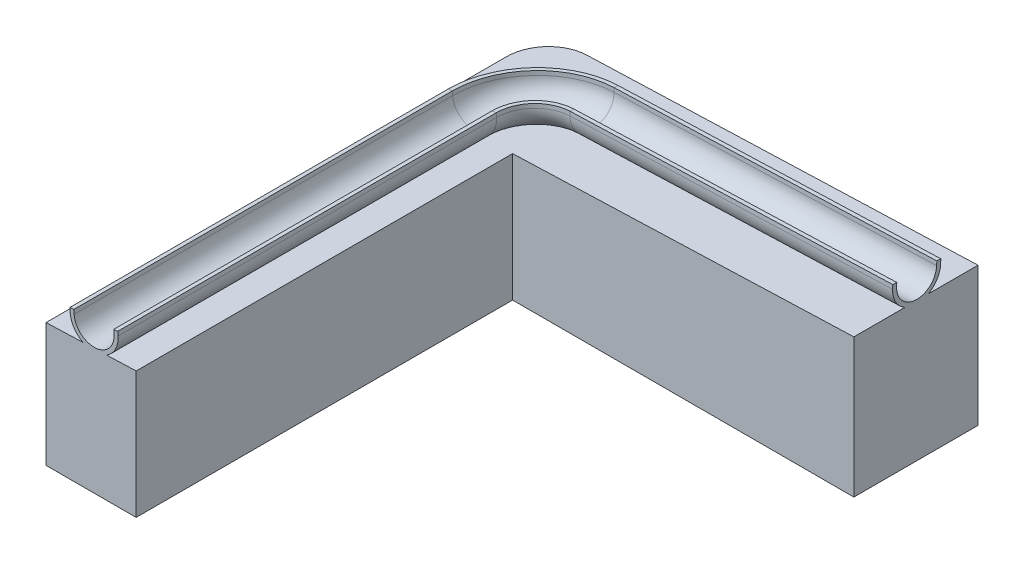
ISO-10303-21;
HEADER;
FILE_DESCRIPTION(('STEP AP214'),'2;1');
FILE_NAME('part.step','',(''),(''),'','','');
FILE_SCHEMA(('AUTOMOTIVE_DESIGN { 1 0 10303 214 1 1 1 1 }'));
ENDSEC;
DATA;
#1=APPLICATION_CONTEXT('core data for automotive mechanical design processes');
#2=APPLICATION_PROTOCOL_DEFINITION('international standard','automotive_design',2000,#1);
#3=PRODUCT_CONTEXT('',#1,'mechanical');
#4=PRODUCT('Part','Part','',(#3));
#5=PRODUCT_RELATED_PRODUCT_CATEGORY('part','',(#4));
#6=PRODUCT_DEFINITION_FORMATION('','',#4);
#7=PRODUCT_DEFINITION_CONTEXT('part definition',#1,'design');
#8=PRODUCT_DEFINITION('design','',#6,#7);
#9=PRODUCT_DEFINITION_SHAPE('','',#8);
#10=(LENGTH_UNIT() NAMED_UNIT(*) SI_UNIT(.MILLI.,.METRE.));
#11=(NAMED_UNIT(*) PLANE_ANGLE_UNIT() SI_UNIT($,.RADIAN.));
#12=(NAMED_UNIT(*) SI_UNIT($,.STERADIAN.) SOLID_ANGLE_UNIT());
#13=UNCERTAINTY_MEASURE_WITH_UNIT(LENGTH_MEASURE(1.E-05),#10,'distance_accuracy_value','');
#14=(GEOMETRIC_REPRESENTATION_CONTEXT(3) GLOBAL_UNCERTAINTY_ASSIGNED_CONTEXT((#13)) GLOBAL_UNIT_ASSIGNED_CONTEXT((#10,
#11,#12)) REPRESENTATION_CONTEXT('',''));
#15=CARTESIAN_POINT('',(0.,0.,0.));
#16=DIRECTION('',(0.,0.,1.));
#17=DIRECTION('',(1.,0.,0.));
#18=AXIS2_PLACEMENT_3D('',#15,#16,#17);
#19=CARTESIAN_POINT('',(0.,-52.6973639920468,0.));
#20=DIRECTION('',(0.,-1.,0.));
#21=DIRECTION('',(0.,0.,-1.));
#22=AXIS2_PLACEMENT_3D('',#19,#20,#21);
#23=PLANE('',#22);
#24=DIRECTION('',(0.,0.,-1.));
#25=VECTOR('',#24,1.);
#26=CARTESIAN_POINT('',(-80.,-52.6973639920468,0.));
#27=LINE('',#26,#25);
#28=CARTESIAN_POINT('',(-80.,-52.6973639920468,33.9999999999974));
#29=VERTEX_POINT('',#28);
#30=CARTESIAN_POINT('',(-80.,-52.6973639920469,-60.));
#31=VERTEX_POINT('',#30);
#32=EDGE_CURVE('E214',#29,#31,#27,.T.);
#33=ORIENTED_EDGE('',*,*,#32,.F.);
#34=DIRECTION('',(1.,0.,0.));
#35=VECTOR('',#34,1.);
#36=CARTESIAN_POINT('',(0.,-52.6973639920468,33.9999999999975));
#37=LINE('',#36,#35);
#38=CARTESIAN_POINT('',(-102.508702833862,-52.6973639920468,33.9999999999975));
#39=VERTEX_POINT('',#38);
#40=EDGE_CURVE('E268',#39,#29,#37,.T.);
#41=ORIENTED_EDGE('',*,*,#40,.F.);
#42=DIRECTION('',(0.,0.,1.));
#43=VECTOR('',#42,1.);
#44=CARTESIAN_POINT('',(-102.508702833862,-52.6973639920468,78.5000726509589));
#45=LINE('',#44,#43);
#46=CARTESIAN_POINT('',(-102.508702833862,-52.6973639920468,-81.));
#47=VERTEX_POINT('',#46);
#48=EDGE_CURVE('E270',#47,#39,#45,.T.);
#49=ORIENTED_EDGE('',*,*,#48,.F.);
#50=CARTESIAN_POINT('',(-92.5087028338616,-52.6973639920468,-81.));
#51=DIRECTION('',(0.,-1.,0.));
#52=DIRECTION('',(0.,0.,-1.));
#53=AXIS2_PLACEMENT_3D('',#50,#51,#52);
#54=CIRCLE('',#53,10.);
#55=CARTESIAN_POINT('',(-92.5087028338616,-52.6973639920468,-91.));
#56=VERTEX_POINT('',#55);
#57=EDGE_CURVE('E11',#47,#56,#54,.T.);
#58=ORIENTED_EDGE('',*,*,#57,.T.);
#59=DIRECTION('',(-1.,0.,0.));
#60=VECTOR('',#59,1.);
#61=CARTESIAN_POINT('',(5.20948620237505,-52.6973639920468,-91.));
#62=LINE('',#61,#60);
#63=CARTESIAN_POINT('',(5.20948620237505,-52.6973639920468,-91.));
#64=VERTEX_POINT('',#63);
#65=EDGE_CURVE('E222',#64,#56,#62,.T.);
#66=ORIENTED_EDGE('',*,*,#65,.F.);
#67=DIRECTION('',(0.,0.,-1.));
#68=VECTOR('',#67,1.);
#69=CARTESIAN_POINT('',(5.20948620237505,-52.6973639920468,148.114783010654));
#70=LINE('',#69,#68);
#71=CARTESIAN_POINT('',(5.20948620237505,-52.6973639920468,-60.));
#72=VERTEX_POINT('',#71);
#73=EDGE_CURVE('E218',#72,#64,#70,.T.);
#74=ORIENTED_EDGE('',*,*,#73,.F.);
#75=DIRECTION('',(-1.,0.,0.));
#76=VECTOR('',#75,1.);
#77=CARTESIAN_POINT('',(5.20948620237505,-52.6973639920468,-60.));
#78=LINE('',#77,#76);
#79=EDGE_CURVE('E211',#72,#31,#78,.T.);
#80=ORIENTED_EDGE('',*,*,#79,.T.);
#81=EDGE_LOOP('',(#33,#41,#49,#58,#66,#74,#80));
#82=FACE_BOUND('',#81,.T.);
#83=ADVANCED_FACE('F33',(#82),#23,.T.);
#84=CARTESIAN_POINT('',(-84.5201097219953,-15.7296405085045,-60.5000000000001));
#85=DIRECTION('',(0.997564050259842,0.0697564737438712,0.));
#86=DIRECTION('',(-0.0697564737438712,0.997564050259842,0.));
#87=AXIS2_PLACEMENT_3D('',#84,#85,#86);
#88=PLANE('',#87);
#89=DIRECTION('',(-0.0697564737438712,0.997564050259842,0.));
#90=VECTOR('',#89,1.);
#91=CARTESIAN_POINT('',(-84.5201097219953,-15.7296405085045,-60.5000000000001));
#92=LINE('',#91,#90);
#93=CARTESIAN_POINT('',(-84.5201097219953,-15.7296405085045,-60.5000000000001));
#94=VERTEX_POINT('',#93);
#95=CARTESIAN_POINT('',(-84.5898661957392,-14.7320764582446,-60.5000000000001));
#96=VERTEX_POINT('',#95);
#97=EDGE_CURVE('E326',#94,#96,#92,.T.);
#98=ORIENTED_EDGE('',*,*,#97,.T.);
#99=DIRECTION('',(0.,0.,1.));
#100=VECTOR('',#99,1.);
#101=CARTESIAN_POINT('',(-84.5898661957392,-14.7320764582446,-60.5000000000001));
#102=LINE('',#101,#100);
#103=CARTESIAN_POINT('',(-84.5898661957392,-14.7320764582446,33.9999999999974));
#104=VERTEX_POINT('',#103);
#105=EDGE_CURVE('E407',#96,#104,#102,.T.);
#106=ORIENTED_EDGE('',*,*,#105,.T.);
#107=DIRECTION('',(-0.0697564737438712,0.997564050259842,0.));
#108=VECTOR('',#107,1.);
#109=CARTESIAN_POINT('',(-84.5201097219953,-15.7296405085045,33.9999999999974));
#110=LINE('',#109,#108);
#111=CARTESIAN_POINT('',(-84.5201097219953,-15.7296405085045,33.9999999999974));
#112=VERTEX_POINT('',#111);
#113=EDGE_CURVE('E383',#112,#104,#110,.T.);
#114=ORIENTED_EDGE('',*,*,#113,.F.);
#115=DIRECTION('',(0.,0.,1.));
#116=VECTOR('',#115,1.);
#117=CARTESIAN_POINT('',(-84.5201097219953,-15.7296405085045,-60.5000000000001));
#118=LINE('',#117,#116);
#119=EDGE_CURVE('E410',#94,#112,#118,.T.);
#120=ORIENTED_EDGE('',*,*,#119,.F.);
#121=EDGE_LOOP('',(#98,#106,#114,#120));
#122=FACE_BOUND('',#121,.T.);
#123=ADVANCED_FACE('F474',(#122),#88,.T.);
#124=CARTESIAN_POINT('',(-84.5898661957392,-14.7320764582446,-60.5000000000001));
#125=DIRECTION('',(-0.0697564737441103,0.997564050259825,0.));
#126=DIRECTION('',(-0.997564050259825,-0.0697564737441103,0.));
#127=AXIS2_PLACEMENT_3D('',#124,#125,#126);
#128=PLANE('',#127);
#129=DIRECTION('',(-0.997564050259825,-0.0697564737441103,0.));
#130=VECTOR('',#129,1.);
#131=CARTESIAN_POINT('',(-84.5898661957392,-14.7320764582446,-60.5000000000001));
#132=LINE('',#131,#130);
#133=CARTESIAN_POINT('',(-85.5874302459995,-14.8018329319888,-60.5000000000001));
#134=VERTEX_POINT('',#133);
#135=EDGE_CURVE('E323',#96,#134,#132,.T.);
#136=ORIENTED_EDGE('',*,*,#135,.T.);
#137=DIRECTION('',(0.,0.,1.));
#138=VECTOR('',#137,1.);
#139=CARTESIAN_POINT('',(-85.5874302459995,-14.8018329319888,-60.5000000000001));
#140=LINE('',#139,#138);
#141=CARTESIAN_POINT('',(-85.5874302459995,-14.8018329319888,33.9999999999974));
#142=VERTEX_POINT('',#141);
#143=EDGE_CURVE('E404',#134,#142,#140,.T.);
#144=ORIENTED_EDGE('',*,*,#143,.T.);
#145=DIRECTION('',(-0.997564050259825,-0.0697564737441103,0.));
#146=VECTOR('',#145,1.);
#147=CARTESIAN_POINT('',(-84.5898661957392,-14.7320764582446,33.9999999999974));
#148=LINE('',#147,#146);
#149=EDGE_CURVE('E380',#104,#142,#148,.T.);
#150=ORIENTED_EDGE('',*,*,#149,.F.);
#151=ORIENTED_EDGE('',*,*,#105,.F.);
#152=EDGE_LOOP('',(#136,#144,#150,#151));
#153=FACE_BOUND('',#152,.T.);
#154=ADVANCED_FACE('F480',(#153),#128,.T.);
#155=CARTESIAN_POINT('',(-85.5874302459995,-14.8018329319888,-60.5000000000001));
#156=DIRECTION('',(-0.997564050259814,-0.069756473744273,0.));
#157=DIRECTION('',(0.069756473744273,-0.997564050259814,0.));
#158=AXIS2_PLACEMENT_3D('',#155,#156,#157);
#159=PLANE('',#158);
#160=DIRECTION('',(0.069756473744273,-0.997564050259814,0.));
#161=VECTOR('',#160,1.);
#162=CARTESIAN_POINT('',(-85.5874302459995,-14.8018329319888,-60.5000000000001));
#163=LINE('',#162,#161);
#164=CARTESIAN_POINT('',(-85.5176737722553,-15.7993969822486,-60.5000000000001));
#165=VERTEX_POINT('',#164);
#166=EDGE_CURVE('E320',#134,#165,#163,.T.);
#167=ORIENTED_EDGE('',*,*,#166,.T.);
#168=DIRECTION('',(0.,0.,1.));
#169=VECTOR('',#168,1.);
#170=CARTESIAN_POINT('',(-85.5176737722553,-15.7993969822486,-60.5000000000001));
#171=LINE('',#170,#169);
#172=CARTESIAN_POINT('',(-85.5176737722552,-15.7993969822486,33.9999999999974));
#173=VERTEX_POINT('',#172);
#174=EDGE_CURVE('E401',#165,#173,#171,.T.);
#175=ORIENTED_EDGE('',*,*,#174,.T.);
#176=DIRECTION('',(0.069756473744273,-0.997564050259814,0.));
#177=VECTOR('',#176,1.);
#178=CARTESIAN_POINT('',(-85.5874302459995,-14.8018329319888,33.9999999999974));
#179=LINE('',#178,#177);
#180=EDGE_CURVE('E377',#142,#173,#179,.T.);
#181=ORIENTED_EDGE('',*,*,#180,.F.);
#182=ORIENTED_EDGE('',*,*,#143,.F.);
#183=EDGE_LOOP('',(#167,#175,#181,#182));
#184=FACE_BOUND('',#183,.T.);
#185=ADVANCED_FACE('F486',(#184),#159,.T.);
#186=CARTESIAN_POINT('',(-90.5054940235545,-16.1481793509691,-60.5));
#187=DIRECTION('',(0.,0.,1.));
#188=DIRECTION('',(1.,0.,0.));
#189=AXIS2_PLACEMENT_3D('',#186,#187,#188);
#190=CYLINDRICAL_SURFACE('',#189,5.00000000000016);
#191=CARTESIAN_POINT('',(-90.5054940235545,-16.1481793509691,-60.5));
#192=DIRECTION('',(0.,0.,-1.));
#193=DIRECTION('',(0.0348994967024938,-0.999390827019096,0.));
#194=AXIS2_PLACEMENT_3D('',#191,#192,#193);
#195=CIRCLE('',#194,5.00000000000016);
#196=CARTESIAN_POINT('',(-95.4933142748538,-16.4969617196897,-60.4999999999999));
#197=VERTEX_POINT('',#196);
#198=EDGE_CURVE('E317',#165,#197,#195,.T.);
#199=ORIENTED_EDGE('',*,*,#198,.T.);
#200=DIRECTION('',(0.,0.,1.));
#201=VECTOR('',#200,1.);
#202=CARTESIAN_POINT('',(-95.4933142748538,-16.4969617196897,-60.4999999999999));
#203=LINE('',#202,#201);
#204=CARTESIAN_POINT('',(-95.4933142748538,-16.4969617196897,33.9999999999975));
#205=VERTEX_POINT('',#204);
#206=EDGE_CURVE('E398',#197,#205,#203,.T.);
#207=ORIENTED_EDGE('',*,*,#206,.T.);
#208=CARTESIAN_POINT('',(-90.5054940235545,-16.1481793509691,33.9999999999975));
#209=DIRECTION('',(0.,0.,-1.));
#210=DIRECTION('',(0.0348994967024938,-0.999390827019096,0.));
#211=AXIS2_PLACEMENT_3D('',#208,#209,#210);
#212=CIRCLE('',#211,5.00000000000016);
#213=EDGE_CURVE('E374',#173,#205,#212,.T.);
#214=ORIENTED_EDGE('',*,*,#213,.F.);
#215=ORIENTED_EDGE('',*,*,#174,.F.);
#216=EDGE_LOOP('',(#199,#207,#214,#215));
#217=FACE_BOUND('',#216,.T.);
#218=ADVANCED_FACE('F492',(#217),#190,.F.);
#219=CARTESIAN_POINT('',(-95.4933142748538,-16.4969617196897,-60.4999999999999));
#220=DIRECTION('',(0.997564050259834,0.069756473743982,0.));
#221=DIRECTION('',(-0.069756473743982,0.997564050259834,0.));
#222=AXIS2_PLACEMENT_3D('',#219,#220,#221);
#223=PLANE('',#222);
#224=DIRECTION('',(-0.069756473743982,0.997564050259834,0.));
#225=VECTOR('',#224,1.);
#226=CARTESIAN_POINT('',(-95.4933142748538,-16.4969617196897,-60.4999999999999));
#227=LINE('',#226,#225);
#228=CARTESIAN_POINT('',(-95.5630707485978,-15.4993976694299,-60.4999999999999));
#229=VERTEX_POINT('',#228);
#230=EDGE_CURVE('E314',#197,#229,#227,.T.);
#231=ORIENTED_EDGE('',*,*,#230,.T.);
#232=DIRECTION('',(0.,0.,1.));
#233=VECTOR('',#232,1.);
#234=CARTESIAN_POINT('',(-95.5630707485978,-15.4993976694299,-60.4999999999999));
#235=LINE('',#234,#233);
#236=CARTESIAN_POINT('',(-95.5630707485978,-15.4993976694299,33.9999999999976));
#237=VERTEX_POINT('',#236);
#238=EDGE_CURVE('E395',#229,#237,#235,.T.);
#239=ORIENTED_EDGE('',*,*,#238,.T.);
#240=DIRECTION('',(-0.069756473743982,0.997564050259834,0.));
#241=VECTOR('',#240,1.);
#242=CARTESIAN_POINT('',(-95.4933142748538,-16.4969617196897,33.9999999999976));
#243=LINE('',#242,#241);
#244=EDGE_CURVE('E371',#205,#237,#243,.T.);
#245=ORIENTED_EDGE('',*,*,#244,.F.);
#246=ORIENTED_EDGE('',*,*,#206,.F.);
#247=EDGE_LOOP('',(#231,#239,#245,#246));
#248=FACE_BOUND('',#247,.T.);
#249=ADVANCED_FACE('F498',(#248),#223,.T.);
#250=CARTESIAN_POINT('',(-95.5630707485978,-15.4993976694299,-60.4999999999999));
#251=DIRECTION('',(-0.0697564737441116,0.997564050259825,0.));
#252=DIRECTION('',(-0.997564050259825,-0.0697564737441116,0.));
#253=AXIS2_PLACEMENT_3D('',#250,#251,#252);
#254=PLANE('',#253);
#255=DIRECTION('',(-0.997564050259825,-0.0697564737441116,0.));
#256=VECTOR('',#255,1.);
#257=CARTESIAN_POINT('',(-95.5630707485978,-15.4993976694299,-60.4999999999999));
#258=LINE('',#257,#256);
#259=CARTESIAN_POINT('',(-96.5606347988576,-15.569154143174,-60.4999999999999));
#260=VERTEX_POINT('',#259);
#261=EDGE_CURVE('E311',#229,#260,#258,.T.);
#262=ORIENTED_EDGE('',*,*,#261,.T.);
#263=DIRECTION('',(0.,0.,1.));
#264=VECTOR('',#263,1.);
#265=CARTESIAN_POINT('',(-96.5606347988576,-15.569154143174,-60.4999999999999));
#266=LINE('',#265,#264);
#267=CARTESIAN_POINT('',(-96.5606347988576,-15.569154143174,33.9999999999976));
#268=VERTEX_POINT('',#267);
#269=EDGE_CURVE('E392',#260,#268,#266,.T.);
#270=ORIENTED_EDGE('',*,*,#269,.T.);
#271=DIRECTION('',(-0.997564050259825,-0.0697564737441116,0.));
#272=VECTOR('',#271,1.);
#273=CARTESIAN_POINT('',(-95.5630707485978,-15.4993976694299,33.9999999999976));
#274=LINE('',#273,#272);
#275=EDGE_CURVE('E368',#237,#268,#274,.T.);
#276=ORIENTED_EDGE('',*,*,#275,.F.);
#277=ORIENTED_EDGE('',*,*,#238,.F.);
#278=EDGE_LOOP('',(#262,#270,#276,#277));
#279=FACE_BOUND('',#278,.T.);
#280=ADVANCED_FACE('F504',(#279),#254,.T.);
#281=CARTESIAN_POINT('',(-96.5606347988576,-15.569154143174,-60.4999999999999));
#282=DIRECTION('',(-0.997564050259822,-0.0697564737441621,0.));
#283=DIRECTION('',(0.0697564737441621,-0.997564050259822,0.));
#284=AXIS2_PLACEMENT_3D('',#281,#282,#283);
#285=PLANE('',#284);
#286=DIRECTION('',(0.0697564737441621,-0.997564050259822,0.));
#287=VECTOR('',#286,1.);
#288=CARTESIAN_POINT('',(-96.5606347988576,-15.569154143174,-60.4999999999999));
#289=LINE('',#288,#287);
#290=CARTESIAN_POINT('',(-96.4908783251135,-16.5667181934338,-60.4999999999999));
#291=VERTEX_POINT('',#290);
#292=EDGE_CURVE('E308',#260,#291,#289,.T.);
#293=ORIENTED_EDGE('',*,*,#292,.T.);
#294=DIRECTION('',(0.,0.,1.));
#295=VECTOR('',#294,1.);
#296=CARTESIAN_POINT('',(-96.4908783251135,-16.5667181934338,-60.4999999999999));
#297=LINE('',#296,#295);
#298=CARTESIAN_POINT('',(-96.4908783251135,-16.5667181934338,33.9999999999976));
#299=VERTEX_POINT('',#298);
#300=EDGE_CURVE('E389',#291,#299,#297,.T.);
#301=ORIENTED_EDGE('',*,*,#300,.T.);
#302=DIRECTION('',(0.0697564737441621,-0.997564050259822,0.));
#303=VECTOR('',#302,1.);
#304=CARTESIAN_POINT('',(-96.5606347988576,-15.569154143174,33.9999999999976));
#305=LINE('',#304,#303);
#306=EDGE_CURVE('E365',#268,#299,#305,.T.);
#307=ORIENTED_EDGE('',*,*,#306,.F.);
#308=ORIENTED_EDGE('',*,*,#269,.F.);
#309=EDGE_LOOP('',(#293,#301,#307,#308));
#310=FACE_BOUND('',#309,.T.);
#311=ADVANCED_FACE('F510',(#310),#285,.T.);
#312=CARTESIAN_POINT('',(-90.5054940235545,-16.1481793509691,-60.5));
#313=DIRECTION('',(0.,0.,1.));
#314=DIRECTION('',(1.,0.,0.));
#315=AXIS2_PLACEMENT_3D('',#312,#313,#314);
#316=CYLINDRICAL_SURFACE('',#315,6.00000000000004);
#317=CARTESIAN_POINT('',(-90.5054940235545,-16.1481793509691,-60.5));
#318=DIRECTION('',(0.,0.,1.));
#319=DIRECTION('',(0.0348994967024938,-0.999390827019096,0.));
#320=AXIS2_PLACEMENT_3D('',#317,#318,#319);
#321=CIRCLE('',#320,6.00000000000004);
#322=CARTESIAN_POINT('',(-93.2518846926383,-21.4827213456272,-60.4999999999999));
#323=VERTEX_POINT('',#322);
#324=EDGE_CURVE('E305',#291,#323,#321,.T.);
#325=ORIENTED_EDGE('',*,*,#324,.T.);
#326=DIRECTION('',(0.,0.,1.));
#327=VECTOR('',#326,1.);
#328=CARTESIAN_POINT('',(-93.2518846925721,-21.4827213456613,-60.5));
#329=LINE('',#328,#327);
#330=CARTESIAN_POINT('',(-93.2518846926359,-21.4827213456272,33.9999999999975));
#331=VERTEX_POINT('',#330);
#332=EDGE_CURVE('E450',#323,#331,#329,.T.);
#333=ORIENTED_EDGE('',*,*,#332,.T.);
#334=CARTESIAN_POINT('',(-90.5054940235545,-16.1481793509691,33.9999999999975));
#335=DIRECTION('',(0.,0.,1.));
#336=DIRECTION('',(0.0348994967024938,-0.999390827019096,0.));
#337=AXIS2_PLACEMENT_3D('',#334,#335,#336);
#338=CIRCLE('',#337,6.00000000000004);
#339=EDGE_CURVE('E362',#299,#331,#338,.T.);
#340=ORIENTED_EDGE('',*,*,#339,.F.);
#341=ORIENTED_EDGE('',*,*,#300,.F.);
#342=EDGE_LOOP('',(#325,#333,#340,#341));
#343=FACE_BOUND('',#342,.T.);
#344=ADVANCED_FACE('F515',(#343),#316,.T.);
#345=CARTESIAN_POINT('',(-90.5054940235545,-16.1481793509691,33.9999999999975));
#346=DIRECTION('',(0.,0.,1.));
#347=DIRECTION('',(0.0348994967024938,-0.999390827019096,0.));
#348=AXIS2_PLACEMENT_3D('',#345,#346,#347);
#349=PLANE('',#348);
#350=DIRECTION('',(0.,-1.,0.));
#351=VECTOR('',#350,1.);
#352=CARTESIAN_POINT('',(-80.,-16.1481793509691,33.9999999999973));
#353=LINE('',#352,#351);
#354=CARTESIAN_POINT('',(-80.,-21.0199553349446,33.9999999999975));
#355=VERTEX_POINT('',#354);
#356=EDGE_CURVE('E230',#355,#29,#353,.T.);
#357=ORIENTED_EDGE('',*,*,#356,.F.);
#358=DIRECTION('',(-0.999390827019096,-0.0348994967024937,0.));
#359=VECTOR('',#358,1.);
#360=CARTESIAN_POINT('',(-107.193456897799,-21.9695717749562,33.9999999999975));
#361=LINE('',#360,#359);
#362=CARTESIAN_POINT('',(-87.3936745855202,-21.2781481408425,33.9999999999974));
#363=VERTEX_POINT('',#362);
#364=EDGE_CURVE('E263',#355,#363,#361,.T.);
#365=ORIENTED_EDGE('',*,*,#364,.T.);
#366=CARTESIAN_POINT('',(-90.5054940235545,-16.1481793509691,33.9999999999975));
#367=DIRECTION('',(0.,0.,1.));
#368=DIRECTION('',(0.0348994967024938,-0.999390827019096,0.));
#369=AXIS2_PLACEMENT_3D('',#366,#367,#368);
#370=CIRCLE('',#369,6.00000000000026);
#371=EDGE_CURVE('E386',#363,#112,#370,.T.);
#372=ORIENTED_EDGE('',*,*,#371,.T.);
#373=ORIENTED_EDGE('',*,*,#113,.T.);
#374=ORIENTED_EDGE('',*,*,#149,.T.);
#375=ORIENTED_EDGE('',*,*,#180,.T.);
#376=ORIENTED_EDGE('',*,*,#213,.T.);
#377=ORIENTED_EDGE('',*,*,#244,.T.);
#378=ORIENTED_EDGE('',*,*,#275,.T.);
#379=ORIENTED_EDGE('',*,*,#306,.T.);
#380=ORIENTED_EDGE('',*,*,#339,.T.);
#381=CARTESIAN_POINT('',(-102.508702833862,-21.8059765581639,33.9999999999975));
#382=VERTEX_POINT('',#381);
#383=EDGE_CURVE('E262',#331,#382,#361,.T.);
#384=ORIENTED_EDGE('',*,*,#383,.T.);
#385=DIRECTION('',(0.,1.,0.));
#386=VECTOR('',#385,1.);
#387=CARTESIAN_POINT('',(-102.508702833862,100.717003128766,33.9999999999975));
#388=LINE('',#387,#386);
#389=EDGE_CURVE('E265',#39,#382,#388,.T.);
#390=ORIENTED_EDGE('',*,*,#389,.F.);
#391=ORIENTED_EDGE('',*,*,#40,.T.);
#392=EDGE_LOOP('',(#357,#365,#372,#373,#374,#375,#376,#377,#378,#379,#380,#384,#390,#391));
#393=FACE_BOUND('',#392,.T.);
#394=ADVANCED_FACE('F518',(#393),#349,.T.);
#395=CARTESIAN_POINT('',(-90.5054940235545,-16.1481793509691,-60.5));
#396=DIRECTION('',(0.,0.,1.));
#397=DIRECTION('',(1.,0.,0.));
#398=AXIS2_PLACEMENT_3D('',#395,#396,#397);
#399=CYLINDRICAL_SURFACE('',#398,6.00000000000026);
#400=CARTESIAN_POINT('',(-90.5054940235545,-16.1481793509691,-60.5));
#401=DIRECTION('',(0.,0.,1.));
#402=DIRECTION('',(0.0348994967024938,-0.999390827019096,0.));
#403=AXIS2_PLACEMENT_3D('',#400,#401,#402);
#404=CIRCLE('',#403,6.00000000000026);
#405=CARTESIAN_POINT('',(-87.3936745855748,-21.2781481408785,-60.5));
#406=VERTEX_POINT('',#405);
#407=EDGE_CURVE('E329',#406,#94,#404,.T.);
#408=ORIENTED_EDGE('',*,*,#407,.T.);
#409=ORIENTED_EDGE('',*,*,#119,.T.);
#410=ORIENTED_EDGE('',*,*,#371,.F.);
#411=DIRECTION('',(0.,0.,1.));
#412=VECTOR('',#411,1.);
#413=CARTESIAN_POINT('',(-87.3936745855798,-21.2781481408787,-60.5));
#414=LINE('',#413,#412);
#415=EDGE_CURVE('E428',#363,#406,#414,.F.);
#416=ORIENTED_EDGE('',*,*,#415,.T.);
#417=EDGE_LOOP('',(#408,#409,#410,#416));
#418=FACE_BOUND('',#417,.T.);
#419=ADVANCED_FACE('F455',(#418),#399,.T.);
#420=CARTESIAN_POINT('',(-102.508702833862,100.717003128766,-60.));
#421=DIRECTION('',(1.,0.,0.));
#422=DIRECTION('',(0.,1.,0.));
#423=AXIS2_PLACEMENT_3D('',#420,#421,#422);
#424=PLANE('',#423);
#425=DIRECTION('',(0.,0.,1.));
#426=VECTOR('',#425,1.);
#427=CARTESIAN_POINT('',(-102.508702833862,-21.8059765582036,-60.));
#428=LINE('',#427,#426);
#429=CARTESIAN_POINT('',(-102.508702833862,-21.8059765582036,-81.));
#430=VERTEX_POINT('',#429);
#431=EDGE_CURVE('E414',#430,#382,#428,.T.);
#432=ORIENTED_EDGE('',*,*,#431,.F.);
#433=DIRECTION('',(0.,1.,0.));
#434=VECTOR('',#433,1.);
#435=CARTESIAN_POINT('',(-102.508702833862,-52.6973639920468,-81.));
#436=LINE('',#435,#434);
#437=EDGE_CURVE('E41',#430,#47,#436,.F.);
#438=ORIENTED_EDGE('',*,*,#437,.T.);
#439=ORIENTED_EDGE('',*,*,#48,.T.);
#440=ORIENTED_EDGE('',*,*,#389,.T.);
#441=EDGE_LOOP('',(#432,#438,#439,#440));
#442=FACE_BOUND('',#441,.T.);
#443=ADVANCED_FACE('F552',(#442),#424,.F.);
#444=CARTESIAN_POINT('',(-75.3319172337929,-15.6183063735287,-60.5));
#445=DIRECTION('',(-0.0348994967024938,0.999390827019096,0.));
#446=DIRECTION('',(-0.999390827019096,-0.0348994967024938,0.));
#447=AXIS2_PLACEMENT_3D('',#444,#445,#446);
#448=TOROIDAL_SURFACE('',#447,15.1828257569866,6.00000000000026);
#449=CARTESIAN_POINT('',(-75.3319172337929,-15.6183063735287,-75.6828257569866));
#450=DIRECTION('',(-0.999390827019096,-0.0348994967024938,0.));
#451=DIRECTION('',(0.0348994967024938,-0.999390827019096,0.));
#452=AXIS2_PLACEMENT_3D('',#449,#450,#451);
#453=CIRCLE('',#452,6.00000000000026);
#454=CARTESIAN_POINT('',(-75.1492028493166,-20.850561765824,-72.7519352841942));
#455=VERTEX_POINT('',#454);
#456=CARTESIAN_POINT('',(-75.3392250830133,-15.4090369522963,-69.6864807948718));
#457=VERTEX_POINT('',#456);
#458=EDGE_CURVE('E281',#455,#457,#453,.T.);
#459=ORIENTED_EDGE('',*,*,#458,.T.);
#460=CARTESIAN_POINT('',(-75.3392250830134,-15.4090369522963,-60.5));
#461=DIRECTION('',(-0.0348994967024938,0.999390827019096,0.));
#462=DIRECTION('',(-0.999390827019096,-0.0348994967024938,0.));
#463=AXIS2_PLACEMENT_3D('',#460,#461,#462);
#464=CIRCLE('',#463,9.18648079487178);
#465=EDGE_CURVE('E353',#457,#94,#464,.T.);
#466=ORIENTED_EDGE('',*,*,#465,.T.);
#467=ORIENTED_EDGE('',*,*,#407,.F.);
#468=CARTESIAN_POINT('',(-75.1492028493176,-20.8505617657945,-60.5));
#469=DIRECTION('',(-0.0348994967024938,0.999390827019096,0.));
#470=DIRECTION('',(-0.999390827019096,-0.0348994967024938,0.));
#471=AXIS2_PLACEMENT_3D('',#468,#469,#470);
#472=CIRCLE('',#471,12.2519352841415);
#473=EDGE_CURVE('E356',#455,#406,#472,.T.);
#474=ORIENTED_EDGE('',*,*,#473,.F.);
#475=EDGE_LOOP('',(#459,#466,#467,#474));
#476=FACE_BOUND('',#475,.T.);
#477=ADVANCED_FACE('F465',(#476),#448,.T.);
#478=CARTESIAN_POINT('',(-75.3319172337929,-15.6183063735287,-60.5));
#479=DIRECTION('',(-0.0348994967024938,0.999390827019096,0.));
#480=DIRECTION('',(-0.999390827019096,-0.0348994967024938,0.));
#481=AXIS2_PLACEMENT_3D('',#478,#479,#480);
#482=TOROIDAL_SURFACE('',#481,15.1828257569866,6.00000000000004);
#483=CARTESIAN_POINT('',(-75.3319172337929,-15.6183063735287,-75.6828257569866));
#484=DIRECTION('',(-0.999390827019096,-0.0348994967024938,0.));
#485=DIRECTION('',(0.0348994967024938,-0.999390827019096,0.));
#486=AXIS2_PLACEMENT_3D('',#483,#484,#485);
#487=CIRCLE('',#486,6.00000000000004);
#488=CARTESIAN_POINT('',(-75.3246093845724,-15.827575794761,-81.6791707191012));
#489=VERTEX_POINT('',#488);
#490=CARTESIAN_POINT('',(-75.1492028493167,-20.850561765824,-78.6137162297786));
#491=VERTEX_POINT('',#490);
#492=EDGE_CURVE('E278',#489,#491,#487,.T.);
#493=ORIENTED_EDGE('',*,*,#492,.T.);
#494=CARTESIAN_POINT('',(-75.1492028493176,-20.8505617657943,-60.5));
#495=DIRECTION('',(-0.0348994967024938,0.999390827019096,0.));
#496=DIRECTION('',(-0.999390827019096,-0.0348994967024938,0.));
#497=AXIS2_PLACEMENT_3D('',#494,#495,#496);
#498=CIRCLE('',#497,18.1137162298317);
#499=EDGE_CURVE('E359',#491,#323,#498,.T.);
#500=ORIENTED_EDGE('',*,*,#499,.T.);
#501=ORIENTED_EDGE('',*,*,#324,.F.);
#502=CARTESIAN_POINT('',(-75.3246093845723,-15.827575794761,-60.5));
#503=DIRECTION('',(-0.0348994967024938,0.999390827019096,0.));
#504=DIRECTION('',(-0.999390827019096,-0.0348994967024938,0.));
#505=AXIS2_PLACEMENT_3D('',#502,#503,#504);
#506=CIRCLE('',#505,21.1791707191012);
#507=EDGE_CURVE('E332',#489,#291,#506,.T.);
#508=ORIENTED_EDGE('',*,*,#507,.F.);
#509=EDGE_LOOP('',(#493,#500,#501,#508));
#510=FACE_BOUND('',#509,.T.);
#511=ADVANCED_FACE('F512',(#510),#482,.T.);
#512=CARTESIAN_POINT('',(-75.3392250830134,-15.4090369522963,-60.5));
#513=DIRECTION('',(-0.0348994967024938,0.999390827019096,0.));
#514=DIRECTION('',(-0.999390827019096,-0.0348994967024938,0.));
#515=AXIS2_PLACEMENT_3D('',#512,#513,#514);
#516=CONICAL_SURFACE('',#515,9.18648079487178,0.0349065850396391);
#517=DIRECTION('',(-0.0348782368720561,0.998782025129921,-0.0348994967022536));
#518=VECTOR('',#517,1.);
#519=CARTESIAN_POINT('',(-75.3392250830133,-15.4090369522963,-69.6864807948718));
#520=LINE('',#519,#518);
#521=CARTESIAN_POINT('',(-75.3741033198854,-14.4102549271664,-69.721380291574));
#522=VERTEX_POINT('',#521);
#523=EDGE_CURVE('E284',#457,#522,#520,.T.);
#524=ORIENTED_EDGE('',*,*,#523,.T.);
#525=CARTESIAN_POINT('',(-75.3741033198854,-14.4102549271664,-60.5));
#526=DIRECTION('',(-0.0348994967024938,0.999390827019096,0.));
#527=DIRECTION('',(-0.999390827019096,-0.0348994967024938,0.));
#528=AXIS2_PLACEMENT_3D('',#525,#526,#527);
#529=CIRCLE('',#528,9.22138029157404);
#530=EDGE_CURVE('E350',#522,#96,#529,.T.);
#531=ORIENTED_EDGE('',*,*,#530,.T.);
#532=ORIENTED_EDGE('',*,*,#97,.F.);
#533=ORIENTED_EDGE('',*,*,#465,.F.);
#534=EDGE_LOOP('',(#524,#531,#532,#533));
#535=FACE_BOUND('',#534,.T.);
#536=ADVANCED_FACE('F469',(#535),#516,.F.);
#537=CARTESIAN_POINT('',(-75.3741033198854,-14.4102549271664,-60.5));
#538=DIRECTION('',(0.0348994967024938,-0.999390827019096,0.));
#539=DIRECTION('',(0.999390827019096,0.0348994967024938,0.));
#540=AXIS2_PLACEMENT_3D('',#537,#538,#539);
#541=CONICAL_SURFACE('',#540,9.22138029157404,1.53588974175502);
#542=DIRECTION('',(0.00121797487007335,-0.0348782368720552,-0.999390827019096));
#543=VECTOR('',#542,1.);
#544=CARTESIAN_POINT('',(-75.3741033198854,-14.4102549271664,-69.721380291574));
#545=LINE('',#544,#543);
#546=CARTESIAN_POINT('',(-75.3728853450153,-14.4451331640385,-70.7207711185936));
#547=VERTEX_POINT('',#546);
#548=EDGE_CURVE('E287',#522,#547,#545,.T.);
#549=ORIENTED_EDGE('',*,*,#548,.T.);
#550=CARTESIAN_POINT('',(-75.3728853450153,-14.4451331640385,-60.5));
#551=DIRECTION('',(-0.0348994967024938,0.999390827019096,0.));
#552=DIRECTION('',(-0.999390827019096,-0.0348994967024938,0.));
#553=AXIS2_PLACEMENT_3D('',#550,#551,#552);
#554=CIRCLE('',#553,10.2207711185936);
#555=EDGE_CURVE('E347',#547,#134,#554,.T.);
#556=ORIENTED_EDGE('',*,*,#555,.T.);
#557=ORIENTED_EDGE('',*,*,#135,.F.);
#558=ORIENTED_EDGE('',*,*,#530,.F.);
#559=EDGE_LOOP('',(#549,#556,#557,#558));
#560=FACE_BOUND('',#559,.T.);
#561=ADVANCED_FACE('F476',(#560),#541,.T.);
#562=CARTESIAN_POINT('',(-75.3728853450153,-14.4451331640385,-60.5));
#563=DIRECTION('',(-0.0348994967024938,0.999390827019096,0.));
#564=DIRECTION('',(-0.999390827019096,-0.0348994967024938,0.));
#565=AXIS2_PLACEMENT_3D('',#562,#563,#564);
#566=CONICAL_SURFACE('',#565,10.2207711185936,0.0349065850400419);
#567=DIRECTION('',(0.0348782368720562,-0.998782025129907,0.0348994967026561));
#568=VECTOR('',#567,1.);
#569=CARTESIAN_POINT('',(-75.3728853450153,-14.4451331640385,-70.7207711185936));
#570=LINE('',#569,#568);
#571=CARTESIAN_POINT('',(-75.3380071081432,-15.4439151891684,-70.685871621891));
#572=VERTEX_POINT('',#571);
#573=EDGE_CURVE('E290',#547,#572,#570,.T.);
#574=ORIENTED_EDGE('',*,*,#573,.T.);
#575=CARTESIAN_POINT('',(-75.3380071081433,-15.4439151891684,-60.5));
#576=DIRECTION('',(-0.0348994967024938,0.999390827019096,0.));
#577=DIRECTION('',(-0.999390827019096,-0.0348994967024938,0.));
#578=AXIS2_PLACEMENT_3D('',#575,#576,#577);
#579=CIRCLE('',#578,10.185871621891);
#580=EDGE_CURVE('E344',#572,#165,#579,.T.);
#581=ORIENTED_EDGE('',*,*,#580,.T.);
#582=ORIENTED_EDGE('',*,*,#166,.F.);
#583=ORIENTED_EDGE('',*,*,#555,.F.);
#584=EDGE_LOOP('',(#574,#581,#582,#583));
#585=FACE_BOUND('',#584,.T.);
#586=ADVANCED_FACE('F482',(#585),#566,.T.);
#587=CARTESIAN_POINT('',(-75.3319172337929,-15.6183063735287,-60.5));
#588=DIRECTION('',(-0.0348994967024938,0.999390827019096,0.));
#589=DIRECTION('',(-0.999390827019096,-0.0348994967024938,0.));
#590=AXIS2_PLACEMENT_3D('',#587,#588,#589);
#591=TOROIDAL_SURFACE('',#590,15.1828257569866,5.00000000000016);
#592=CARTESIAN_POINT('',(-75.3319172337929,-15.6183063735287,-75.6828257569866));
#593=DIRECTION('',(0.999390827019096,0.0348994967024938,0.));
#594=DIRECTION('',(0.0348994967024938,-0.999390827019096,0.));
#595=AXIS2_PLACEMENT_3D('',#592,#593,#594);
#596=CIRCLE('',#595,5.00000000000016);
#597=CARTESIAN_POINT('',(-75.3258273594425,-15.7926975578889,-80.6797798920823));
#598=VERTEX_POINT('',#597);
#599=EDGE_CURVE('E293',#572,#598,#596,.T.);
#600=ORIENTED_EDGE('',*,*,#599,.T.);
#601=CARTESIAN_POINT('',(-75.3258273594424,-15.7926975578889,-60.5));
#602=DIRECTION('',(-0.0348994967024938,0.999390827019096,0.));
#603=DIRECTION('',(-0.999390827019096,-0.0348994967024938,0.));
#604=AXIS2_PLACEMENT_3D('',#601,#602,#603);
#605=CIRCLE('',#604,20.1797798920823);
#606=EDGE_CURVE('E341',#598,#197,#605,.T.);
#607=ORIENTED_EDGE('',*,*,#606,.T.);
#608=ORIENTED_EDGE('',*,*,#198,.F.);
#609=ORIENTED_EDGE('',*,*,#580,.F.);
#610=EDGE_LOOP('',(#600,#607,#608,#609));
#611=FACE_BOUND('',#610,.T.);
#612=ADVANCED_FACE('F488',(#611),#591,.F.);
#613=CARTESIAN_POINT('',(-75.3258273594424,-15.7926975578889,-60.5));
#614=DIRECTION('',(-0.0348994967024938,0.999390827019096,0.));
#615=DIRECTION('',(-0.999390827019096,-0.0348994967024938,0.));
#616=AXIS2_PLACEMENT_3D('',#613,#614,#615);
#617=CONICAL_SURFACE('',#616,20.1797798920823,0.0349065850397502);
#618=DIRECTION('',(-0.0348782368720561,0.998782025129917,-0.0348994967023646));
#619=VECTOR('',#618,1.);
#620=CARTESIAN_POINT('',(-75.3258273594425,-15.7926975578889,-80.6797798920823));
#621=LINE('',#620,#619);
#622=CARTESIAN_POINT('',(-75.3607055963146,-14.793915532759,-80.7146793887846));
#623=VERTEX_POINT('',#622);
#624=EDGE_CURVE('E296',#598,#623,#621,.T.);
#625=ORIENTED_EDGE('',*,*,#624,.T.);
#626=CARTESIAN_POINT('',(-75.3607055963145,-14.793915532759,-60.5));
#627=DIRECTION('',(-0.0348994967024938,0.999390827019096,0.));
#628=DIRECTION('',(-0.999390827019096,-0.0348994967024938,0.));
#629=AXIS2_PLACEMENT_3D('',#626,#627,#628);
#630=CIRCLE('',#629,20.2146793887846);
#631=EDGE_CURVE('E338',#623,#229,#630,.T.);
#632=ORIENTED_EDGE('',*,*,#631,.T.);
#633=ORIENTED_EDGE('',*,*,#230,.F.);
#634=ORIENTED_EDGE('',*,*,#606,.F.);
#635=EDGE_LOOP('',(#625,#632,#633,#634));
#636=FACE_BOUND('',#635,.T.);
#637=ADVANCED_FACE('F494',(#636),#617,.F.);
#638=CARTESIAN_POINT('',(-75.3607055963145,-14.793915532759,-60.5));
#639=DIRECTION('',(0.0348994967024938,-0.999390827019096,0.));
#640=DIRECTION('',(0.999390827019096,0.0348994967024938,0.));
#641=AXIS2_PLACEMENT_3D('',#638,#639,#640);
#642=CONICAL_SURFACE('',#641,20.2146793887846,1.53588974175502);
#643=DIRECTION('',(0.00121797487007395,-0.0348782368720566,-0.999390827019096));
#644=VECTOR('',#643,1.);
#645=CARTESIAN_POINT('',(-75.3607055963146,-14.793915532759,-80.7146793887846));
#646=LINE('',#645,#644);
#647=CARTESIAN_POINT('',(-75.3594876214445,-14.8287937696311,-81.7140702158037));
#648=VERTEX_POINT('',#647);
#649=EDGE_CURVE('E299',#623,#648,#646,.T.);
#650=ORIENTED_EDGE('',*,*,#649,.T.);
#651=CARTESIAN_POINT('',(-75.3594876214444,-14.8287937696311,-60.5));
#652=DIRECTION('',(-0.0348994967024938,0.999390827019096,0.));
#653=DIRECTION('',(-0.999390827019096,-0.0348994967024938,0.));
#654=AXIS2_PLACEMENT_3D('',#651,#652,#653);
#655=CIRCLE('',#654,21.2140702158037);
#656=EDGE_CURVE('E335',#648,#260,#655,.T.);
#657=ORIENTED_EDGE('',*,*,#656,.T.);
#658=ORIENTED_EDGE('',*,*,#261,.F.);
#659=ORIENTED_EDGE('',*,*,#631,.F.);
#660=EDGE_LOOP('',(#650,#657,#658,#659));
#661=FACE_BOUND('',#660,.T.);
#662=ADVANCED_FACE('F500',(#661),#642,.T.);
#663=CARTESIAN_POINT('',(-75.3594876214444,-14.8287937696311,-60.5));
#664=DIRECTION('',(-0.0348994967024938,0.999390827019096,0.));
#665=DIRECTION('',(-0.999390827019096,-0.0348994967024938,0.));
#666=AXIS2_PLACEMENT_3D('',#663,#664,#665);
#667=CONICAL_SURFACE('',#666,21.2140702158037,0.0349065850399307);
#668=DIRECTION('',(0.0348782368720561,-0.998782025129911,0.0348994967025451));
#669=VECTOR('',#668,1.);
#670=CARTESIAN_POINT('',(-75.3594876214445,-14.8287937696311,-81.7140702158037));
#671=LINE('',#670,#669);
#672=EDGE_CURVE('E302',#648,#489,#671,.T.);
#673=ORIENTED_EDGE('',*,*,#672,.T.);
#674=ORIENTED_EDGE('',*,*,#507,.T.);
#675=ORIENTED_EDGE('',*,*,#292,.F.);
#676=ORIENTED_EDGE('',*,*,#656,.F.);
#677=EDGE_LOOP('',(#673,#674,#675,#676));
#678=FACE_BOUND('',#677,.T.);
#679=ADVANCED_FACE('F506',(#678),#667,.T.);
#680=CARTESIAN_POINT('',(0.,0.,-91.));
#681=DIRECTION('',(0.,0.,-1.));
#682=DIRECTION('',(-1.,0.,0.));
#683=AXIS2_PLACEMENT_3D('',#680,#681,#682);
#684=PLANE('',#683);
#685=ORIENTED_EDGE('',*,*,#65,.T.);
#686=DIRECTION('',(0.,1.,0.));
#687=VECTOR('',#686,1.);
#688=CARTESIAN_POINT('',(-92.5087028338616,-21.8059765582036,-91.));
#689=LINE('',#688,#687);
#690=CARTESIAN_POINT('',(-92.5087028338617,-21.4567688632465,-91.));
#691=VERTEX_POINT('',#690);
#692=EDGE_CURVE('E427',#56,#691,#689,.T.);
#693=ORIENTED_EDGE('',*,*,#692,.T.);
#694=DIRECTION('',(0.999390827019096,0.0348994967024938,0.));
#695=VECTOR('',#694,1.);
#696=CARTESIAN_POINT('',(140.,-13.3373860467616,-91.));
#697=LINE('',#696,#695);
#698=CARTESIAN_POINT('',(5.20948620237505,-18.0443745087618,-91.));
#699=VERTEX_POINT('',#698);
#700=EDGE_CURVE('E434',#691,#699,#697,.T.);
#701=ORIENTED_EDGE('',*,*,#700,.T.);
#702=DIRECTION('',(0.,-1.,0.));
#703=VECTOR('',#702,1.);
#704=CARTESIAN_POINT('',(5.20948620237505,-52.6973639920468,-91.));
#705=LINE('',#704,#703);
#706=EDGE_CURVE('E272',#699,#64,#705,.T.);
#707=ORIENTED_EDGE('',*,*,#706,.T.);
#708=EDGE_LOOP('',(#685,#693,#701,#707));
#709=FACE_BOUND('',#708,.T.);
#710=ADVANCED_FACE('F433',(#709),#684,.T.);
#711=CARTESIAN_POINT('',(109.333731059459,-9.37916445338763,-81.6791707191012));
#712=DIRECTION('',(0.00121797487008834,-0.0348782368720832,-0.999390827019095));
#713=DIRECTION('',(0.,0.999391568299469,-0.0348782627423952));
#714=AXIS2_PLACEMENT_3D('',#711,#712,#713);
#715=PLANE('',#714);
#716=DIRECTION('',(0.,0.999391568299469,-0.0348782627423952));
#717=VECTOR('',#716,1.);
#718=CARTESIAN_POINT('',(5.20948620237505,-9.38358774283874,-81.8059143649714));
#719=LINE('',#718,#717);
#720=CARTESIAN_POINT('',(5.20948620237504,-13.0152632065434,-81.6791707191012));
#721=VERTEX_POINT('',#720);
#722=CARTESIAN_POINT('',(5.20948620237505,-12.0152632065427,-81.7140702158037));
#723=VERTEX_POINT('',#722);
#724=EDGE_CURVE('E425',#721,#723,#719,.T.);
#725=ORIENTED_EDGE('',*,*,#724,.F.);
#726=DIRECTION('',(-0.999390827019096,-0.0348994967024938,0.));
#727=VECTOR('',#726,1.);
#728=CARTESIAN_POINT('',(109.333731059459,-9.37916445338763,-81.6791707191012));
#729=LINE('',#728,#727);
#730=EDGE_CURVE('E416',#721,#489,#729,.T.);
#731=ORIENTED_EDGE('',*,*,#730,.T.);
#732=ORIENTED_EDGE('',*,*,#672,.F.);
#733=DIRECTION('',(-0.999390827019096,-0.0348994967024938,0.));
#734=VECTOR('',#733,1.);
#735=CARTESIAN_POINT('',(109.298852822587,-8.38038242825772,-81.7140702158037));
#736=LINE('',#735,#734);
#737=EDGE_CURVE('E537',#723,#648,#736,.T.);
#738=ORIENTED_EDGE('',*,*,#737,.F.);
#739=EDGE_LOOP('',(#725,#731,#732,#738));
#740=FACE_BOUND('',#739,.T.);
#741=ADVANCED_FACE('F546',(#740),#715,.T.);
#742=CARTESIAN_POINT('',(109.298852822587,-8.38038242825772,-81.7140702158037));
#743=DIRECTION('',(-0.0348782368720555,0.998782025129913,-0.0348994967024938));
#744=DIRECTION('',(0.,0.0349207435583522,0.999390084836412));
#745=AXIS2_PLACEMENT_3D('',#742,#743,#744);
#746=PLANE('',#745);
#747=DIRECTION('',(0.,0.0349207435583522,0.999390084836412));
#748=VECTOR('',#747,1.);
#749=CARTESIAN_POINT('',(5.20948620237505,-12.0108306208973,-81.5872148944826));
#750=LINE('',#749,#748);
#751=CARTESIAN_POINT('',(5.20948620237505,-11.9803424370517,-80.7146793887846));
#752=VERTEX_POINT('',#751);
#753=EDGE_CURVE('E231',#723,#752,#750,.T.);
#754=ORIENTED_EDGE('',*,*,#753,.F.);
#755=ORIENTED_EDGE('',*,*,#737,.T.);
#756=ORIENTED_EDGE('',*,*,#649,.F.);
#757=DIRECTION('',(-0.999390827019096,-0.0348994967024938,0.));
#758=VECTOR('',#757,1.);
#759=CARTESIAN_POINT('',(109.297634847717,-8.34550419138566,-80.7146793887846));
#760=LINE('',#759,#758);
#761=EDGE_CURVE('E536',#752,#623,#760,.T.);
#762=ORIENTED_EDGE('',*,*,#761,.F.);
#763=EDGE_LOOP('',(#754,#755,#756,#762));
#764=FACE_BOUND('',#763,.T.);
#765=ADVANCED_FACE('F592',(#764),#746,.T.);
#766=CARTESIAN_POINT('',(109.297634847717,-8.34550419138566,-80.7146793887846));
#767=DIRECTION('',(-0.00121797487008157,0.0348782368718892,0.999390827019102));
#768=DIRECTION('',(0.,-0.999391568299476,0.0348782627422011));
#769=AXIS2_PLACEMENT_3D('',#766,#767,#768);
#770=PLANE('',#769);
#771=DIRECTION('',(0.,-0.999391568299476,0.0348782627422011));
#772=VECTOR('',#771,1.);
#773=CARTESIAN_POINT('',(5.20948620237505,-8.34992594743792,-80.841379097092));
#774=LINE('',#773,#772);
#775=CARTESIAN_POINT('',(5.20948620237505,-12.9803424370528,-80.6797798920823));
#776=VERTEX_POINT('',#775);
#777=EDGE_CURVE('E242',#752,#776,#774,.T.);
#778=ORIENTED_EDGE('',*,*,#777,.F.);
#779=ORIENTED_EDGE('',*,*,#761,.T.);
#780=ORIENTED_EDGE('',*,*,#624,.F.);
#781=DIRECTION('',(-0.999390827019096,-0.0348994967024938,0.));
#782=VECTOR('',#781,1.);
#783=CARTESIAN_POINT('',(109.332513084589,-9.34428621651558,-80.6797798920823));
#784=LINE('',#783,#782);
#785=EDGE_CURVE('E534',#776,#598,#784,.T.);
#786=ORIENTED_EDGE('',*,*,#785,.F.);
#787=EDGE_LOOP('',(#778,#779,#780,#786));
#788=FACE_BOUND('',#787,.T.);
#789=ADVANCED_FACE('F588',(#788),#770,.T.);
#790=CARTESIAN_POINT('',(109.326423210238,-9.1698950321553,-75.6828257569866));
#791=DIRECTION('',(-0.999390827019096,-0.0348994967024938,0.));
#792=DIRECTION('',(0.0348994967024938,-0.999390827019096,0.));
#793=AXIS2_PLACEMENT_3D('',#790,#791,#792);
#794=CYLINDRICAL_SURFACE('',#793,5.00000000000017);
#795=CARTESIAN_POINT('',(5.20948620237505,-12.805738589593,-75.6828257569866));
#796=DIRECTION('',(-1.,0.,0.));
#797=DIRECTION('',(0.,-1.,0.));
#798=AXIS2_PLACEMENT_3D('',#795,#796,#797);
#799=ELLIPSE('',#798,5.00304772149428,5.00000000000017);
#800=CARTESIAN_POINT('',(5.20948620237505,-12.6311347421342,-70.685871621891));
#801=VERTEX_POINT('',#800);
#802=EDGE_CURVE('E244',#776,#801,#799,.T.);
#803=ORIENTED_EDGE('',*,*,#802,.F.);
#804=ORIENTED_EDGE('',*,*,#785,.T.);
#805=ORIENTED_EDGE('',*,*,#599,.F.);
#806=DIRECTION('',(-0.999390827019096,-0.0348994967024938,0.));
#807=VECTOR('',#806,1.);
#808=CARTESIAN_POINT('',(109.320333335888,-8.99550384779501,-70.685871621891));
#809=LINE('',#808,#807);
#810=EDGE_CURVE('E530',#801,#572,#809,.T.);
#811=ORIENTED_EDGE('',*,*,#810,.F.);
#812=EDGE_LOOP('',(#803,#804,#805,#811));
#813=FACE_BOUND('',#812,.T.);
#814=ADVANCED_FACE('F584',(#813),#794,.F.);
#815=CARTESIAN_POINT('',(109.320333335888,-8.99550384779501,-70.685871621891));
#816=DIRECTION('',(0.00121797487009318,-0.0348782368722218,-0.99939082701909));
#817=DIRECTION('',(0.,0.999391568299464,-0.0348782627425338));
#818=AXIS2_PLACEMENT_3D('',#815,#816,#817);
#819=PLANE('',#818);
#820=DIRECTION('',(0.,0.999391568299464,-0.0348782627425338));
#821=VECTOR('',#820,1.);
#822=CARTESIAN_POINT('',(5.20948620237505,-8.99992656809908,-70.8125989595874));
#823=LINE('',#822,#821);
#824=CARTESIAN_POINT('',(5.20948620237505,-11.6311347421345,-70.7207711185936));
#825=VERTEX_POINT('',#824);
#826=EDGE_CURVE('E246',#801,#825,#823,.T.);
#827=ORIENTED_EDGE('',*,*,#826,.F.);
#828=ORIENTED_EDGE('',*,*,#810,.T.);
#829=ORIENTED_EDGE('',*,*,#573,.F.);
#830=DIRECTION('',(-0.999390827019096,-0.0348994967024938,0.));
#831=VECTOR('',#830,1.);
#832=CARTESIAN_POINT('',(109.285455099016,-7.9967218226651,-70.7207711185936));
#833=LINE('',#832,#831);
#834=EDGE_CURVE('E528',#825,#547,#833,.T.);
#835=ORIENTED_EDGE('',*,*,#834,.F.);
#836=EDGE_LOOP('',(#827,#828,#829,#835));
#837=FACE_BOUND('',#836,.T.);
#838=ADVANCED_FACE('F580',(#837),#819,.T.);
#839=CARTESIAN_POINT('',(109.285455099016,-7.9967218226651,-70.7207711185936));
#840=DIRECTION('',(-0.0348782368720555,0.998782025129913,-0.0348994967024938));
#841=DIRECTION('',(0.,0.0349207435583522,0.999390084836412));
#842=AXIS2_PLACEMENT_3D('',#839,#840,#841);
#843=PLANE('',#842);
#844=DIRECTION('',(0.,0.0349207435583522,0.999390084836412));
#845=VECTOR('',#844,1.);
#846=CARTESIAN_POINT('',(5.20948620237505,-11.6267027270225,-70.5939321252855));
#847=LINE('',#846,#845);
#848=CARTESIAN_POINT('',(5.20948620237505,-11.5962139726425,-69.721380291574));
#849=VERTEX_POINT('',#848);
#850=EDGE_CURVE('E248',#825,#849,#847,.T.);
#851=ORIENTED_EDGE('',*,*,#850,.F.);
#852=ORIENTED_EDGE('',*,*,#834,.T.);
#853=ORIENTED_EDGE('',*,*,#548,.F.);
#854=DIRECTION('',(-0.999390827019096,-0.0348994967024938,0.));
#855=VECTOR('',#854,1.);
#856=CARTESIAN_POINT('',(109.284237124146,-7.96184358579303,-69.721380291574));
#857=LINE('',#856,#855);
#858=EDGE_CURVE('E527',#849,#522,#857,.T.);
#859=ORIENTED_EDGE('',*,*,#858,.F.);
#860=EDGE_LOOP('',(#851,#852,#853,#859));
#861=FACE_BOUND('',#860,.T.);
#862=ADVANCED_FACE('F577',(#861),#843,.T.);
#863=CARTESIAN_POINT('',(109.284237124146,-7.96184358579303,-69.721380291574));
#864=DIRECTION('',(-0.00121797487008253,0.0348782368719169,0.999390827019101));
#865=DIRECTION('',(0.,-0.999391568299475,0.0348782627422288));
#866=AXIS2_PLACEMENT_3D('',#863,#864,#865);
#867=PLANE('',#866);
#868=DIRECTION('',(0.,-0.999391568299475,0.0348782627422288));
#869=VECTOR('',#868,1.);
#870=CARTESIAN_POINT('',(5.20948620237505,-7.96626477269822,-69.8480636917072));
#871=LINE('',#870,#869);
#872=CARTESIAN_POINT('',(5.20948620237505,-12.5962139726422,-69.6864807948717));
#873=VERTEX_POINT('',#872);
#874=EDGE_CURVE('E250',#849,#873,#871,.T.);
#875=ORIENTED_EDGE('',*,*,#874,.F.);
#876=ORIENTED_EDGE('',*,*,#858,.T.);
#877=ORIENTED_EDGE('',*,*,#523,.F.);
#878=DIRECTION('',(-0.999390827019096,-0.0348994967024938,0.));
#879=VECTOR('',#878,1.);
#880=CARTESIAN_POINT('',(109.319115361018,-8.96062561092295,-69.6864807948717));
#881=LINE('',#880,#879);
#882=EDGE_CURVE('E444',#873,#457,#881,.T.);
#883=ORIENTED_EDGE('',*,*,#882,.F.);
#884=EDGE_LOOP('',(#875,#876,#877,#883));
#885=FACE_BOUND('',#884,.T.);
#886=ADVANCED_FACE('F574',(#885),#867,.T.);
#887=CARTESIAN_POINT('',(109.326423210238,-9.1698950321553,-75.6828257569866));
#888=DIRECTION('',(-0.999390827019096,-0.0348994967024938,0.));
#889=DIRECTION('',(0.0348994967024938,-0.999390827019096,0.));
#890=AXIS2_PLACEMENT_3D('',#887,#888,#889);
#891=CYLINDRICAL_SURFACE('',#890,6.00000000000017);
#892=CARTESIAN_POINT('',(5.20948620237505,-12.805738589593,-75.6828257569866));
#893=DIRECTION('',(-1.,0.,0.));
#894=DIRECTION('',(0.,-1.,0.));
#895=AXIS2_PLACEMENT_3D('',#892,#893,#894);
#896=ELLIPSE('',#895,6.0036572657931,6.00000000000017);
#897=CARTESIAN_POINT('',(5.20948620237505,-18.0443745087618,-78.6137162298317));
#898=VERTEX_POINT('',#897);
#899=EDGE_CURVE('E252',#898,#721,#896,.F.);
#900=ORIENTED_EDGE('',*,*,#899,.F.);
#901=DIRECTION('',(-0.999390827019096,-0.0348994967024938,0.));
#902=VECTOR('',#901,1.);
#903=CARTESIAN_POINT('',(109.509137594713,-14.402150424421,-78.6137162298317));
#904=LINE('',#903,#902);
#905=EDGE_CURVE('E442',#491,#898,#904,.F.);
#906=ORIENTED_EDGE('',*,*,#905,.F.);
#907=ORIENTED_EDGE('',*,*,#492,.F.);
#908=ORIENTED_EDGE('',*,*,#730,.F.);
#909=EDGE_LOOP('',(#900,#906,#907,#908));
#910=FACE_BOUND('',#909,.T.);
#911=ADVANCED_FACE('F550',(#910),#891,.T.);
#912=CARTESIAN_POINT('',(5.20948620237505,-12.805738589593,-75.6828257569866));
#913=DIRECTION('',(-1.,0.,0.));
#914=DIRECTION('',(0.,-1.,0.));
#915=AXIS2_PLACEMENT_3D('',#912,#913,#914);
#916=ELLIPSE('',#915,6.0036572657931,6.00000000000017);
#917=CARTESIAN_POINT('',(5.20948620237505,-18.0443745087618,-72.7519352841415));
#918=VERTEX_POINT('',#917);
#919=EDGE_CURVE('E254',#873,#918,#916,.F.);
#920=ORIENTED_EDGE('',*,*,#919,.F.);
#921=ORIENTED_EDGE('',*,*,#882,.T.);
#922=ORIENTED_EDGE('',*,*,#458,.F.);
#923=DIRECTION('',(-0.999390827019096,-0.0348994967024938,0.));
#924=VECTOR('',#923,1.);
#925=CARTESIAN_POINT('',(109.509137594713,-14.402150424421,-72.7519352841415));
#926=LINE('',#925,#924);
#927=EDGE_CURVE('E440',#918,#455,#926,.T.);
#928=ORIENTED_EDGE('',*,*,#927,.F.);
#929=EDGE_LOOP('',(#920,#921,#922,#928));
#930=FACE_BOUND('',#929,.T.);
#931=ADVANCED_FACE('F523',(#930),#891,.T.);
#932=CARTESIAN_POINT('',(0.,0.,-60.));
#933=DIRECTION('',(0.,0.,-1.));
#934=DIRECTION('',(-1.,0.,0.));
#935=AXIS2_PLACEMENT_3D('',#932,#933,#934);
#936=PLANE('',#935);
#937=DIRECTION('',(0.,-1.,0.));
#938=VECTOR('',#937,1.);
#939=CARTESIAN_POINT('',(5.20948620237505,-52.6973639920468,-60.));
#940=LINE('',#939,#938);
#941=CARTESIAN_POINT('',(5.20948620237505,-18.0443745087618,-60.));
#942=VERTEX_POINT('',#941);
#943=EDGE_CURVE('E221',#942,#72,#940,.T.);
#944=ORIENTED_EDGE('',*,*,#943,.F.);
#945=DIRECTION('',(0.999390827019096,0.0348994967024938,0.));
#946=VECTOR('',#945,1.);
#947=CARTESIAN_POINT('',(140.,-13.3373860467616,-60.));
#948=LINE('',#947,#946);
#949=CARTESIAN_POINT('',(-80.,-21.0199553349446,-60.));
#950=VERTEX_POINT('',#949);
#951=EDGE_CURVE('E235',#950,#942,#948,.T.);
#952=ORIENTED_EDGE('',*,*,#951,.F.);
#953=DIRECTION('',(0.,1.,0.));
#954=VECTOR('',#953,1.);
#955=CARTESIAN_POINT('',(-80.,-217.697363992047,-60.));
#956=LINE('',#955,#954);
#957=EDGE_CURVE('E227',#31,#950,#956,.T.);
#958=ORIENTED_EDGE('',*,*,#957,.F.);
#959=ORIENTED_EDGE('',*,*,#79,.F.);
#960=EDGE_LOOP('',(#944,#952,#958,#959));
#961=FACE_BOUND('',#960,.T.);
#962=ADVANCED_FACE('F233',(#961),#936,.F.);
#963=CARTESIAN_POINT('',(140.,-13.3373860467616,-91.));
#964=DIRECTION('',(0.0348994967024938,-0.999390827019096,0.));
#965=DIRECTION('',(0.999390827019096,0.0348994967024938,0.));
#966=AXIS2_PLACEMENT_3D('',#963,#964,#965);
#967=PLANE('',#966);
#968=ORIENTED_EDGE('',*,*,#951,.T.);
#969=DIRECTION('',(0.,0.,-1.));
#970=VECTOR('',#969,1.);
#971=CARTESIAN_POINT('',(5.20948620237505,-18.0443745087618,-91.));
#972=LINE('',#971,#970);
#973=EDGE_CURVE('E256',#942,#918,#972,.T.);
#974=ORIENTED_EDGE('',*,*,#973,.T.);
#975=ORIENTED_EDGE('',*,*,#927,.T.);
#976=ORIENTED_EDGE('',*,*,#473,.T.);
#977=ORIENTED_EDGE('',*,*,#415,.F.);
#978=ORIENTED_EDGE('',*,*,#364,.F.);
#979=DIRECTION('',(0.,0.,-1.));
#980=VECTOR('',#979,1.);
#981=CARTESIAN_POINT('',(-80.,-21.019955334976,60.));
#982=LINE('',#981,#980);
#983=EDGE_CURVE('E413',#355,#950,#982,.T.);
#984=ORIENTED_EDGE('',*,*,#983,.T.);
#985=EDGE_LOOP('',(#968,#974,#975,#976,#977,#978,#984));
#986=FACE_BOUND('',#985,.T.);
#987=ADVANCED_FACE('F461',(#986),#967,.F.);
#988=CARTESIAN_POINT('',(5.20948620237505,-52.6973639920468,148.114783010654));
#989=DIRECTION('',(1.,0.,0.));
#990=DIRECTION('',(0.,0.,-1.));
#991=AXIS2_PLACEMENT_3D('',#988,#989,#990);
#992=PLANE('',#991);
#993=ORIENTED_EDGE('',*,*,#706,.F.);
#994=DIRECTION('',(0.,0.,-1.));
#995=VECTOR('',#994,1.);
#996=CARTESIAN_POINT('',(5.20948620237505,-18.0443745087618,-91.));
#997=LINE('',#996,#995);
#998=EDGE_CURVE('E259',#898,#699,#997,.T.);
#999=ORIENTED_EDGE('',*,*,#998,.F.);
#1000=ORIENTED_EDGE('',*,*,#899,.T.);
#1001=ORIENTED_EDGE('',*,*,#724,.T.);
#1002=ORIENTED_EDGE('',*,*,#753,.T.);
#1003=ORIENTED_EDGE('',*,*,#777,.T.);
#1004=ORIENTED_EDGE('',*,*,#802,.T.);
#1005=ORIENTED_EDGE('',*,*,#826,.T.);
#1006=ORIENTED_EDGE('',*,*,#850,.T.);
#1007=ORIENTED_EDGE('',*,*,#874,.T.);
#1008=ORIENTED_EDGE('',*,*,#919,.T.);
#1009=ORIENTED_EDGE('',*,*,#973,.F.);
#1010=ORIENTED_EDGE('',*,*,#943,.T.);
#1011=ORIENTED_EDGE('',*,*,#73,.T.);
#1012=EDGE_LOOP('',(#993,#999,#1000,#1001,#1002,#1003,#1004,#1005,#1006,#1007,#1008,#1009,#1010,#1011));
#1013=FACE_BOUND('',#1012,.T.);
#1014=ADVANCED_FACE('F560',(#1013),#992,.T.);
#1015=ORIENTED_EDGE('',*,*,#700,.F.);
#1016=CARTESIAN_POINT('',(-92.5087028338616,-21.4567688632465,-81.));
#1017=DIRECTION('',(0.0348994967024938,-0.999390827019096,0.));
#1018=DIRECTION('',(-0.999390827019096,-0.0348994967024938,0.));
#1019=AXIS2_PLACEMENT_3D('',#1016,#1017,#1018);
#1020=ELLIPSE('',#1019,10.0060954429882,10.);
#1021=EDGE_CURVE('E55',#691,#430,#1020,.F.);
#1022=ORIENTED_EDGE('',*,*,#1021,.T.);
#1023=ORIENTED_EDGE('',*,*,#431,.T.);
#1024=ORIENTED_EDGE('',*,*,#383,.F.);
#1025=ORIENTED_EDGE('',*,*,#332,.F.);
#1026=ORIENTED_EDGE('',*,*,#499,.F.);
#1027=ORIENTED_EDGE('',*,*,#905,.T.);
#1028=ORIENTED_EDGE('',*,*,#998,.T.);
#1029=EDGE_LOOP('',(#1015,#1022,#1023,#1024,#1025,#1026,#1027,#1028));
#1030=FACE_BOUND('',#1029,.T.);
#1031=ADVANCED_FACE('F438',(#1030),#967,.F.);
#1032=CARTESIAN_POINT('',(-92.5087028338616,0.,-81.));
#1033=DIRECTION('',(0.,-1.,0.));
#1034=DIRECTION('',(1.,0.,0.));
#1035=AXIS2_PLACEMENT_3D('',#1032,#1033,#1034);
#1036=CYLINDRICAL_SURFACE('',#1035,10.);
#1037=ORIENTED_EDGE('',*,*,#57,.F.);
#1038=ORIENTED_EDGE('',*,*,#437,.F.);
#1039=ORIENTED_EDGE('',*,*,#1021,.F.);
#1040=ORIENTED_EDGE('',*,*,#692,.F.);
#1041=EDGE_LOOP('',(#1037,#1038,#1039,#1040));
#1042=FACE_BOUND('',#1041,.T.);
#1043=ADVANCED_FACE('F35',(#1042),#1036,.T.);
#1044=CARTESIAN_POINT('',(-80.,-217.697363992047,-60.));
#1045=DIRECTION('',(-1.,0.,0.));
#1046=DIRECTION('',(0.,0.,1.));
#1047=AXIS2_PLACEMENT_3D('',#1044,#1045,#1046);
#1048=PLANE('',#1047);
#1049=ORIENTED_EDGE('',*,*,#32,.T.);
#1050=ORIENTED_EDGE('',*,*,#957,.T.);
#1051=ORIENTED_EDGE('',*,*,#983,.F.);
#1052=ORIENTED_EDGE('',*,*,#356,.T.);
#1053=EDGE_LOOP('',(#1049,#1050,#1051,#1052));
#1054=FACE_BOUND('',#1053,.T.);
#1055=ADVANCED_FACE('F226',(#1054),#1048,.F.);
#1056=CLOSED_SHELL('',(#83,#123,#154,#185,#218,#249,#280,#311,#344,#394,#419,#443,#477,#511,
#536,#561,#586,#612,#637,#662,#679,#710,#741,#765,#789,#814,#838,#862,#886,#911,#931,#962,#987,
#1014,#1031,#1043,#1055));
#1057=MANIFOLD_SOLID_BREP('B2',#1056);
#1058=ADVANCED_BREP_SHAPE_REPRESENTATION('',(#18,#1057),#14);
#1059=SHAPE_DEFINITION_REPRESENTATION(#9,#1058);
ENDSEC;
END-ISO-10303-21;
